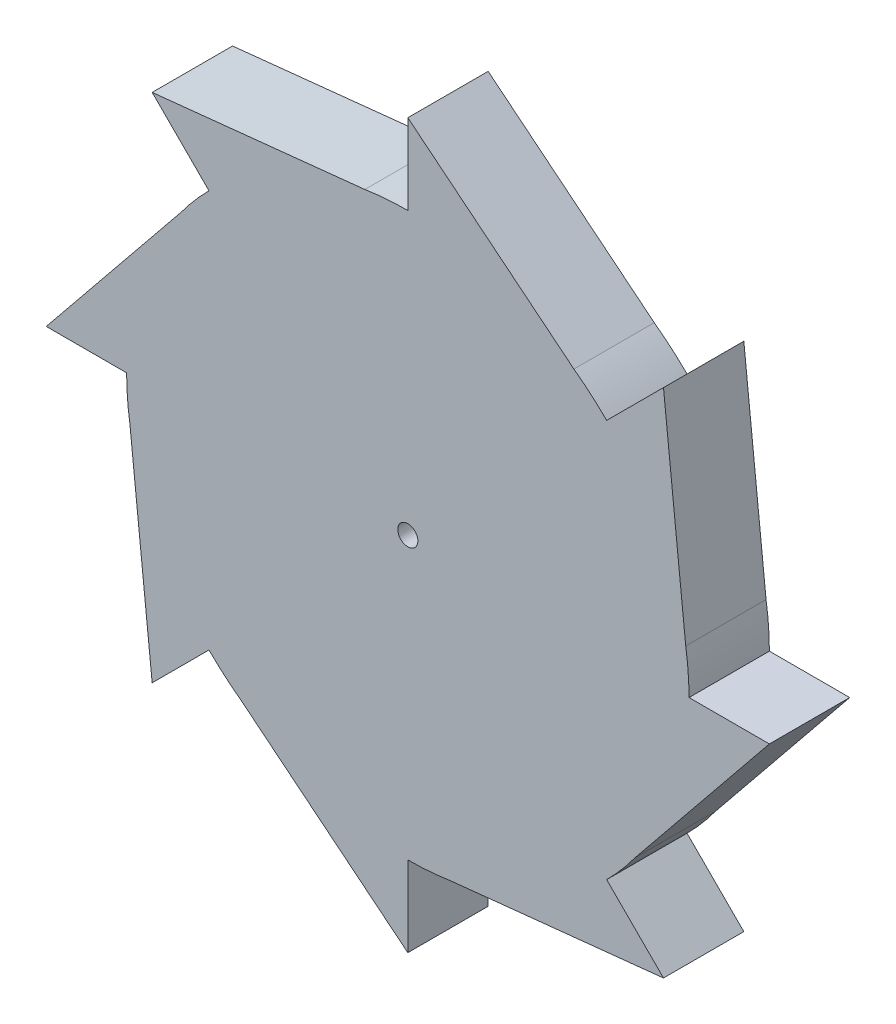
ISO-10303-21;
HEADER;
FILE_DESCRIPTION(('STEP AP214'),'2;1');
FILE_NAME('part.step','',(''),(''),'','','');
FILE_SCHEMA(('AUTOMOTIVE_DESIGN { 1 0 10303 214 1 1 1 1 }'));
ENDSEC;
DATA;
#1=APPLICATION_CONTEXT('core data for automotive mechanical design processes');
#2=APPLICATION_PROTOCOL_DEFINITION('international standard','automotive_design',2000,#1);
#3=PRODUCT_CONTEXT('',#1,'mechanical');
#4=PRODUCT('Part','Part','',(#3));
#5=PRODUCT_RELATED_PRODUCT_CATEGORY('part','',(#4));
#6=PRODUCT_DEFINITION_FORMATION('','',#4);
#7=PRODUCT_DEFINITION_CONTEXT('part definition',#1,'design');
#8=PRODUCT_DEFINITION('design','',#6,#7);
#9=PRODUCT_DEFINITION_SHAPE('','',#8);
#10=(LENGTH_UNIT() NAMED_UNIT(*) SI_UNIT(.MILLI.,.METRE.));
#11=(NAMED_UNIT(*) PLANE_ANGLE_UNIT() SI_UNIT($,.RADIAN.));
#12=(NAMED_UNIT(*) SI_UNIT($,.STERADIAN.) SOLID_ANGLE_UNIT());
#13=UNCERTAINTY_MEASURE_WITH_UNIT(LENGTH_MEASURE(1.E-05),#10,'distance_accuracy_value','');
#14=(GEOMETRIC_REPRESENTATION_CONTEXT(3) GLOBAL_UNCERTAINTY_ASSIGNED_CONTEXT((#13)) GLOBAL_UNIT_ASSIGNED_CONTEXT((#10,
#11,#12)) REPRESENTATION_CONTEXT('',''));
#15=CARTESIAN_POINT('',(0.,0.,0.));
#16=DIRECTION('',(0.,0.,1.));
#17=DIRECTION('',(1.,0.,0.));
#18=AXIS2_PLACEMENT_3D('',#15,#16,#17);
#19=CARTESIAN_POINT('',(0.,0.,6.35));
#20=DIRECTION('',(0.,0.,-1.));
#21=DIRECTION('',(-1.,0.,0.));
#22=AXIS2_PLACEMENT_3D('',#19,#20,#21);
#23=CYLINDRICAL_SURFACE('',#22,22.225);
#24=CARTESIAN_POINT('',(0.,0.,0.));
#25=DIRECTION('',(0.,0.,1.));
#26=DIRECTION('',(1.,0.,0.));
#27=AXIS2_PLACEMENT_3D('',#24,#25,#26);
#28=CIRCLE('',#27,22.225);
#29=CARTESIAN_POINT('',(0.,22.225,0.));
#30=VERTEX_POINT('',#29);
#31=CARTESIAN_POINT('',(-3.39977651162355,21.9634274345106,0.));
#32=VERTEX_POINT('',#31);
#33=EDGE_CURVE('E225',#30,#32,#28,.T.);
#34=ORIENTED_EDGE('',*,*,#33,.T.);
#35=DIRECTION('',(0.,0.,-1.));
#36=VECTOR('',#35,1.);
#37=CARTESIAN_POINT('',(-3.39977651162355,21.9634274345106,6.35));
#38=LINE('',#37,#36);
#39=CARTESIAN_POINT('',(-3.39977651162355,21.9634274345106,6.35));
#40=VERTEX_POINT('',#39);
#41=EDGE_CURVE('E11',#40,#32,#38,.T.);
#42=ORIENTED_EDGE('',*,*,#41,.F.);
#43=CARTESIAN_POINT('',(0.,0.,6.35));
#44=DIRECTION('',(0.,0.,1.));
#45=DIRECTION('',(1.,0.,0.));
#46=AXIS2_PLACEMENT_3D('',#43,#44,#45);
#47=CIRCLE('',#46,22.225);
#48=CARTESIAN_POINT('',(0.,22.225,6.35));
#49=VERTEX_POINT('',#48);
#50=EDGE_CURVE('E272',#49,#40,#47,.T.);
#51=ORIENTED_EDGE('',*,*,#50,.F.);
#52=DIRECTION('',(0.,0.,-1.));
#53=VECTOR('',#52,1.);
#54=CARTESIAN_POINT('',(0.,22.225,6.35));
#55=LINE('',#54,#53);
#56=EDGE_CURVE('E221',#49,#30,#55,.T.);
#57=ORIENTED_EDGE('',*,*,#56,.T.);
#58=EDGE_LOOP('',(#34,#42,#51,#57));
#59=FACE_BOUND('',#58,.T.);
#60=ADVANCED_FACE('F33',(#59),#23,.T.);
#61=CARTESIAN_POINT('',(-20.2055762724053,20.2055762724058,6.35));
#62=DIRECTION('',(0.104030352760059,-0.994574122780508,0.));
#63=DIRECTION('',(0.994574122780508,0.104030352760059,0.));
#64=AXIS2_PLACEMENT_3D('',#61,#62,#63);
#65=PLANE('',#64);
#66=DIRECTION('',(-0.994574122780508,-0.104030352760059,0.));
#67=VECTOR('',#66,1.);
#68=CARTESIAN_POINT('',(-20.2055762724053,20.2055762724058,0.));
#69=LINE('',#68,#67);
#70=CARTESIAN_POINT('',(-20.2055762724053,20.2055762724058,0.));
#71=VERTEX_POINT('',#70);
#72=EDGE_CURVE('E228',#32,#71,#69,.T.);
#73=ORIENTED_EDGE('',*,*,#72,.T.);
#74=DIRECTION('',(0.,0.,-1.));
#75=VECTOR('',#74,1.);
#76=CARTESIAN_POINT('',(-20.2055762724053,20.2055762724058,6.35));
#77=LINE('',#76,#75);
#78=CARTESIAN_POINT('',(-20.2055762724053,20.2055762724058,6.35));
#79=VERTEX_POINT('',#78);
#80=EDGE_CURVE('E41',#79,#71,#77,.T.);
#81=ORIENTED_EDGE('',*,*,#80,.F.);
#82=DIRECTION('',(-0.994574122780508,-0.104030352760059,0.));
#83=VECTOR('',#82,1.);
#84=CARTESIAN_POINT('',(-20.2055762724053,20.2055762724058,6.35));
#85=LINE('',#84,#83);
#86=EDGE_CURVE('E140',#40,#79,#85,.T.);
#87=ORIENTED_EDGE('',*,*,#86,.F.);
#88=ORIENTED_EDGE('',*,*,#41,.T.);
#89=EDGE_LOOP('',(#73,#81,#87,#88));
#90=FACE_BOUND('',#89,.T.);
#91=ADVANCED_FACE('F411',(#90),#65,.F.);
#92=CARTESIAN_POINT('',(-15.7154482118708,15.7154482118712,6.35));
#93=DIRECTION('',(0.707106781186556,0.707106781186539,0.));
#94=DIRECTION('',(-0.707106781186539,0.707106781186556,0.));
#95=AXIS2_PLACEMENT_3D('',#92,#93,#94);
#96=PLANE('',#95);
#97=DIRECTION('',(0.707106781186539,-0.707106781186556,0.));
#98=VECTOR('',#97,1.);
#99=CARTESIAN_POINT('',(-15.7154482118708,15.7154482118712,0.));
#100=LINE('',#99,#98);
#101=CARTESIAN_POINT('',(-15.7154482118708,15.7154482118712,0.));
#102=VERTEX_POINT('',#101);
#103=EDGE_CURVE('E231',#71,#102,#100,.T.);
#104=ORIENTED_EDGE('',*,*,#103,.T.);
#105=DIRECTION('',(0.,0.,-1.));
#106=VECTOR('',#105,1.);
#107=CARTESIAN_POINT('',(-15.7154482118708,15.7154482118712,6.35));
#108=LINE('',#107,#106);
#109=CARTESIAN_POINT('',(-15.7154482118708,15.7154482118712,6.35));
#110=VERTEX_POINT('',#109);
#111=EDGE_CURVE('E327',#110,#102,#108,.T.);
#112=ORIENTED_EDGE('',*,*,#111,.F.);
#113=DIRECTION('',(0.707106781186539,-0.707106781186556,0.));
#114=VECTOR('',#113,1.);
#115=CARTESIAN_POINT('',(-15.7154482118708,15.7154482118712,6.35));
#116=LINE('',#115,#114);
#117=EDGE_CURVE('E335',#79,#110,#116,.T.);
#118=ORIENTED_EDGE('',*,*,#117,.F.);
#119=ORIENTED_EDGE('',*,*,#80,.T.);
#120=EDGE_LOOP('',(#104,#112,#118,#119));
#121=FACE_BOUND('',#120,.T.);
#122=ADVANCED_FACE('F333',(#121),#96,.F.);
#123=CARTESIAN_POINT('',(0.,0.,6.35));
#124=DIRECTION('',(0.,0.,-1.));
#125=DIRECTION('',(-1.,0.,0.));
#126=AXIS2_PLACEMENT_3D('',#123,#124,#125);
#127=CYLINDRICAL_SURFACE('',#126,22.225);
#128=CARTESIAN_POINT('',(0.,0.,0.));
#129=DIRECTION('',(0.,0.,1.));
#130=DIRECTION('',(1.,0.,0.));
#131=AXIS2_PLACEMENT_3D('',#128,#129,#130);
#132=CIRCLE('',#131,22.225);
#133=CARTESIAN_POINT('',(-17.9344935029289,13.1264834511533,0.));
#134=VERTEX_POINT('',#133);
#135=EDGE_CURVE('E233',#102,#134,#132,.T.);
#136=ORIENTED_EDGE('',*,*,#135,.T.);
#137=DIRECTION('',(0.,0.,-1.));
#138=VECTOR('',#137,1.);
#139=CARTESIAN_POINT('',(-17.9344935029289,13.1264834511533,6.35));
#140=LINE('',#139,#138);
#141=CARTESIAN_POINT('',(-17.9344935029289,13.1264834511533,6.35));
#142=VERTEX_POINT('',#141);
#143=EDGE_CURVE('E324',#142,#134,#140,.T.);
#144=ORIENTED_EDGE('',*,*,#143,.F.);
#145=CARTESIAN_POINT('',(0.,0.,6.35));
#146=DIRECTION('',(0.,0.,1.));
#147=DIRECTION('',(1.,0.,0.));
#148=AXIS2_PLACEMENT_3D('',#145,#146,#147);
#149=CIRCLE('',#148,22.225);
#150=EDGE_CURVE('E353',#110,#142,#149,.T.);
#151=ORIENTED_EDGE('',*,*,#150,.F.);
#152=ORIENTED_EDGE('',*,*,#111,.T.);
#153=EDGE_LOOP('',(#136,#144,#151,#152));
#154=FACE_BOUND('',#153,.T.);
#155=ADVANCED_FACE('F344',(#154),#127,.T.);
#156=CARTESIAN_POINT('',(-28.575,2.99307237772328E-13,6.35));
#157=DIRECTION('',(0.776830674496627,-0.629709538724892,0.));
#158=DIRECTION('',(0.629709538724892,0.776830674496627,0.));
#159=AXIS2_PLACEMENT_3D('',#156,#157,#158);
#160=PLANE('',#159);
#161=DIRECTION('',(-0.629709538724892,-0.776830674496627,0.));
#162=VECTOR('',#161,1.);
#163=CARTESIAN_POINT('',(-28.575,2.99307237772328E-13,0.));
#164=LINE('',#163,#162);
#165=CARTESIAN_POINT('',(-28.575,2.99307237772328E-13,0.));
#166=VERTEX_POINT('',#165);
#167=EDGE_CURVE('E235',#134,#166,#164,.T.);
#168=ORIENTED_EDGE('',*,*,#167,.T.);
#169=DIRECTION('',(0.,0.,-1.));
#170=VECTOR('',#169,1.);
#171=CARTESIAN_POINT('',(-28.575,2.99307237772328E-13,6.35));
#172=LINE('',#171,#170);
#173=CARTESIAN_POINT('',(-28.575,2.99307237772328E-13,6.35));
#174=VERTEX_POINT('',#173);
#175=EDGE_CURVE('E321',#174,#166,#172,.T.);
#176=ORIENTED_EDGE('',*,*,#175,.F.);
#177=DIRECTION('',(-0.629709538724892,-0.776830674496627,0.));
#178=VECTOR('',#177,1.);
#179=CARTESIAN_POINT('',(-28.575,2.99307237772328E-13,6.35));
#180=LINE('',#179,#178);
#181=EDGE_CURVE('E350',#142,#174,#180,.T.);
#182=ORIENTED_EDGE('',*,*,#181,.F.);
#183=ORIENTED_EDGE('',*,*,#143,.T.);
#184=EDGE_LOOP('',(#168,#176,#182,#183));
#185=FACE_BOUND('',#184,.T.);
#186=ADVANCED_FACE('F348',(#185),#160,.F.);
#187=CARTESIAN_POINT('',(-22.225,2.32794518267366E-13,6.35));
#188=DIRECTION('',(0.,1.,0.));
#189=DIRECTION('',(-1.,0.,0.));
#190=AXIS2_PLACEMENT_3D('',#187,#188,#189);
#191=PLANE('',#190);
#192=DIRECTION('',(1.,0.,0.));
#193=VECTOR('',#192,1.);
#194=CARTESIAN_POINT('',(-22.225,2.32794518267366E-13,0.));
#195=LINE('',#194,#193);
#196=CARTESIAN_POINT('',(-22.225,2.29729079356211E-13,0.));
#197=VERTEX_POINT('',#196);
#198=EDGE_CURVE('E237',#166,#197,#195,.T.);
#199=ORIENTED_EDGE('',*,*,#198,.T.);
#200=DIRECTION('',(0.,0.,-1.));
#201=VECTOR('',#200,1.);
#202=CARTESIAN_POINT('',(-22.225,2.29729079356211E-13,6.35));
#203=LINE('',#202,#201);
#204=CARTESIAN_POINT('',(-22.225,2.29729079356211E-13,6.35));
#205=VERTEX_POINT('',#204);
#206=EDGE_CURVE('E318',#205,#197,#203,.T.);
#207=ORIENTED_EDGE('',*,*,#206,.F.);
#208=DIRECTION('',(1.,0.,0.));
#209=VECTOR('',#208,1.);
#210=CARTESIAN_POINT('',(-22.225,2.32794518267366E-13,6.35));
#211=LINE('',#210,#209);
#212=EDGE_CURVE('E352',#174,#205,#211,.T.);
#213=ORIENTED_EDGE('',*,*,#212,.F.);
#214=ORIENTED_EDGE('',*,*,#175,.T.);
#215=EDGE_LOOP('',(#199,#207,#213,#214));
#216=FACE_BOUND('',#215,.T.);
#217=ADVANCED_FACE('F424',(#216),#191,.F.);
#218=CARTESIAN_POINT('',(0.,0.,6.35));
#219=DIRECTION('',(0.,0.,-1.));
#220=DIRECTION('',(-1.,0.,0.));
#221=AXIS2_PLACEMENT_3D('',#218,#219,#220);
#222=CYLINDRICAL_SURFACE('',#221,22.225);
#223=CARTESIAN_POINT('',(0.,0.,0.));
#224=DIRECTION('',(0.,0.,1.));
#225=DIRECTION('',(1.,0.,0.));
#226=AXIS2_PLACEMENT_3D('',#223,#224,#225);
#227=CIRCLE('',#226,22.225);
#228=CARTESIAN_POINT('',(-21.9634274345106,-3.39977651162355,0.));
#229=VERTEX_POINT('',#228);
#230=EDGE_CURVE('E239',#197,#229,#227,.T.);
#231=ORIENTED_EDGE('',*,*,#230,.T.);
#232=DIRECTION('',(0.,0.,-1.));
#233=VECTOR('',#232,1.);
#234=CARTESIAN_POINT('',(-21.9634274345106,-3.39977651162355,6.35));
#235=LINE('',#234,#233);
#236=CARTESIAN_POINT('',(-21.9634274345106,-3.39977651162355,6.35));
#237=VERTEX_POINT('',#236);
#238=EDGE_CURVE('E315',#237,#229,#235,.T.);
#239=ORIENTED_EDGE('',*,*,#238,.F.);
#240=CARTESIAN_POINT('',(0.,0.,6.35));
#241=DIRECTION('',(0.,0.,1.));
#242=DIRECTION('',(1.,0.,0.));
#243=AXIS2_PLACEMENT_3D('',#240,#241,#242);
#244=CIRCLE('',#243,22.225);
#245=EDGE_CURVE('E355',#205,#237,#244,.T.);
#246=ORIENTED_EDGE('',*,*,#245,.F.);
#247=ORIENTED_EDGE('',*,*,#206,.T.);
#248=EDGE_LOOP('',(#231,#239,#246,#247));
#249=FACE_BOUND('',#248,.T.);
#250=ADVANCED_FACE('F427',(#249),#222,.T.);
#251=CARTESIAN_POINT('',(-20.2055762724058,-20.2055762724054,6.35));
#252=DIRECTION('',(0.994574122780508,0.104030352760062,0.));
#253=DIRECTION('',(-0.104030352760063,0.994574122780508,0.));
#254=AXIS2_PLACEMENT_3D('',#251,#252,#253);
#255=PLANE('',#254);
#256=DIRECTION('',(0.104030352760062,-0.994574122780508,0.));
#257=VECTOR('',#256,1.);
#258=CARTESIAN_POINT('',(-20.2055762724058,-20.2055762724054,0.));
#259=LINE('',#258,#257);
#260=CARTESIAN_POINT('',(-20.2055762724058,-20.2055762724054,0.));
#261=VERTEX_POINT('',#260);
#262=EDGE_CURVE('E241',#229,#261,#259,.T.);
#263=ORIENTED_EDGE('',*,*,#262,.T.);
#264=DIRECTION('',(0.,0.,-1.));
#265=VECTOR('',#264,1.);
#266=CARTESIAN_POINT('',(-20.2055762724058,-20.2055762724054,6.35));
#267=LINE('',#266,#265);
#268=CARTESIAN_POINT('',(-20.2055762724058,-20.2055762724054,6.35));
#269=VERTEX_POINT('',#268);
#270=EDGE_CURVE('E312',#269,#261,#267,.T.);
#271=ORIENTED_EDGE('',*,*,#270,.F.);
#272=DIRECTION('',(0.104030352760062,-0.994574122780508,0.));
#273=VECTOR('',#272,1.);
#274=CARTESIAN_POINT('',(-20.2055762724058,-20.2055762724054,6.35));
#275=LINE('',#274,#273);
#276=EDGE_CURVE('E361',#237,#269,#275,.T.);
#277=ORIENTED_EDGE('',*,*,#276,.F.);
#278=ORIENTED_EDGE('',*,*,#238,.T.);
#279=EDGE_LOOP('',(#263,#271,#277,#278));
#280=FACE_BOUND('',#279,.T.);
#281=ADVANCED_FACE('F431',(#280),#255,.F.);
#282=CARTESIAN_POINT('',(-15.7154482118712,-15.7154482118709,6.35));
#283=DIRECTION('',(-0.707106781186541,0.707106781186554,0.));
#284=DIRECTION('',(-0.707106781186554,-0.707106781186541,0.));
#285=AXIS2_PLACEMENT_3D('',#282,#283,#284);
#286=PLANE('',#285);
#287=DIRECTION('',(0.707106781186554,0.707106781186541,0.));
#288=VECTOR('',#287,1.);
#289=CARTESIAN_POINT('',(-15.7154482118712,-15.7154482118709,0.));
#290=LINE('',#289,#288);
#291=CARTESIAN_POINT('',(-15.7154482118712,-15.7154482118709,0.));
#292=VERTEX_POINT('',#291);
#293=EDGE_CURVE('E243',#261,#292,#290,.T.);
#294=ORIENTED_EDGE('',*,*,#293,.T.);
#295=DIRECTION('',(0.,0.,-1.));
#296=VECTOR('',#295,1.);
#297=CARTESIAN_POINT('',(-15.7154482118712,-15.7154482118709,6.35));
#298=LINE('',#297,#296);
#299=CARTESIAN_POINT('',(-15.7154482118712,-15.7154482118709,6.35));
#300=VERTEX_POINT('',#299);
#301=EDGE_CURVE('E309',#300,#292,#298,.T.);
#302=ORIENTED_EDGE('',*,*,#301,.F.);
#303=DIRECTION('',(0.707106781186554,0.707106781186541,0.));
#304=VECTOR('',#303,1.);
#305=CARTESIAN_POINT('',(-15.7154482118712,-15.7154482118709,6.35));
#306=LINE('',#305,#304);
#307=EDGE_CURVE('E363',#269,#300,#306,.T.);
#308=ORIENTED_EDGE('',*,*,#307,.F.);
#309=ORIENTED_EDGE('',*,*,#270,.T.);
#310=EDGE_LOOP('',(#294,#302,#308,#309));
#311=FACE_BOUND('',#310,.T.);
#312=ADVANCED_FACE('F435',(#311),#286,.F.);
#313=CARTESIAN_POINT('',(0.,0.,6.35));
#314=DIRECTION('',(0.,0.,-1.));
#315=DIRECTION('',(-1.,0.,0.));
#316=AXIS2_PLACEMENT_3D('',#313,#314,#315);
#317=CYLINDRICAL_SURFACE('',#316,22.225);
#318=CARTESIAN_POINT('',(0.,0.,0.));
#319=DIRECTION('',(0.,0.,1.));
#320=DIRECTION('',(1.,0.,0.));
#321=AXIS2_PLACEMENT_3D('',#318,#319,#320);
#322=CIRCLE('',#321,22.225);
#323=CARTESIAN_POINT('',(-13.1264834511533,-17.9344935029289,0.));
#324=VERTEX_POINT('',#323);
#325=EDGE_CURVE('E245',#292,#324,#322,.T.);
#326=ORIENTED_EDGE('',*,*,#325,.T.);
#327=DIRECTION('',(0.,0.,-1.));
#328=VECTOR('',#327,1.);
#329=CARTESIAN_POINT('',(-13.1264834511533,-17.9344935029289,6.35));
#330=LINE('',#329,#328);
#331=CARTESIAN_POINT('',(-13.1264834511533,-17.9344935029289,6.35));
#332=VERTEX_POINT('',#331);
#333=EDGE_CURVE('E306',#332,#324,#330,.T.);
#334=ORIENTED_EDGE('',*,*,#333,.F.);
#335=CARTESIAN_POINT('',(0.,0.,6.35));
#336=DIRECTION('',(0.,0.,1.));
#337=DIRECTION('',(1.,0.,0.));
#338=AXIS2_PLACEMENT_3D('',#335,#336,#337);
#339=CIRCLE('',#338,22.225);
#340=EDGE_CURVE('E365',#300,#332,#339,.T.);
#341=ORIENTED_EDGE('',*,*,#340,.F.);
#342=ORIENTED_EDGE('',*,*,#301,.T.);
#343=EDGE_LOOP('',(#326,#334,#341,#342));
#344=FACE_BOUND('',#343,.T.);
#345=ADVANCED_FACE('F439',(#344),#317,.T.);
#346=CARTESIAN_POINT('',(-1.99538158514885E-13,-28.575,6.35));
#347=DIRECTION('',(0.629709538724889,0.776830674496629,0.));
#348=DIRECTION('',(-0.776830674496629,0.629709538724889,0.));
#349=AXIS2_PLACEMENT_3D('',#346,#347,#348);
#350=PLANE('',#349);
#351=DIRECTION('',(0.776830674496629,-0.629709538724889,0.));
#352=VECTOR('',#351,1.);
#353=CARTESIAN_POINT('',(-1.99538158514885E-13,-28.575,0.));
#354=LINE('',#353,#352);
#355=CARTESIAN_POINT('',(-1.99538158514885E-13,-28.575,0.));
#356=VERTEX_POINT('',#355);
#357=EDGE_CURVE('E247',#324,#356,#354,.T.);
#358=ORIENTED_EDGE('',*,*,#357,.T.);
#359=DIRECTION('',(0.,0.,-1.));
#360=VECTOR('',#359,1.);
#361=CARTESIAN_POINT('',(-1.99538158514885E-13,-28.575,6.35));
#362=LINE('',#361,#360);
#363=CARTESIAN_POINT('',(-1.99538158514885E-13,-28.575,6.35));
#364=VERTEX_POINT('',#363);
#365=EDGE_CURVE('E303',#364,#356,#362,.T.);
#366=ORIENTED_EDGE('',*,*,#365,.F.);
#367=DIRECTION('',(0.776830674496629,-0.629709538724889,0.));
#368=VECTOR('',#367,1.);
#369=CARTESIAN_POINT('',(-1.99538158514885E-13,-28.575,6.35));
#370=LINE('',#369,#368);
#371=EDGE_CURVE('E367',#332,#364,#370,.T.);
#372=ORIENTED_EDGE('',*,*,#371,.F.);
#373=ORIENTED_EDGE('',*,*,#333,.T.);
#374=EDGE_LOOP('',(#358,#366,#372,#373));
#375=FACE_BOUND('',#374,.T.);
#376=ADVANCED_FACE('F443',(#375),#350,.F.);
#377=CARTESIAN_POINT('',(-1.55196345511577E-13,-22.225,6.35));
#378=DIRECTION('',(-1.,0.,0.));
#379=DIRECTION('',(0.,-1.,0.));
#380=AXIS2_PLACEMENT_3D('',#377,#378,#379);
#381=PLANE('',#380);
#382=DIRECTION('',(0.,1.,0.));
#383=VECTOR('',#382,1.);
#384=CARTESIAN_POINT('',(-1.55196345511577E-13,-22.225,0.));
#385=LINE('',#384,#383);
#386=CARTESIAN_POINT('',(-1.6200078928934E-13,-22.225,0.));
#387=VERTEX_POINT('',#386);
#388=EDGE_CURVE('E249',#356,#387,#385,.T.);
#389=ORIENTED_EDGE('',*,*,#388,.T.);
#390=DIRECTION('',(0.,0.,-1.));
#391=VECTOR('',#390,1.);
#392=CARTESIAN_POINT('',(-1.6200078928934E-13,-22.225,6.35));
#393=LINE('',#392,#391);
#394=CARTESIAN_POINT('',(-1.6200078928934E-13,-22.225,6.35));
#395=VERTEX_POINT('',#394);
#396=EDGE_CURVE('E300',#395,#387,#393,.T.);
#397=ORIENTED_EDGE('',*,*,#396,.F.);
#398=DIRECTION('',(0.,1.,0.));
#399=VECTOR('',#398,1.);
#400=CARTESIAN_POINT('',(-1.55196345511577E-13,-22.225,6.35));
#401=LINE('',#400,#399);
#402=EDGE_CURVE('E369',#364,#395,#401,.T.);
#403=ORIENTED_EDGE('',*,*,#402,.F.);
#404=ORIENTED_EDGE('',*,*,#365,.T.);
#405=EDGE_LOOP('',(#389,#397,#403,#404));
#406=FACE_BOUND('',#405,.T.);
#407=ADVANCED_FACE('F447',(#406),#381,.F.);
#408=CARTESIAN_POINT('',(0.,0.,6.35));
#409=DIRECTION('',(0.,0.,-1.));
#410=DIRECTION('',(-1.,0.,0.));
#411=AXIS2_PLACEMENT_3D('',#408,#409,#410);
#412=CYLINDRICAL_SURFACE('',#411,22.225);
#413=CARTESIAN_POINT('',(0.,0.,0.));
#414=DIRECTION('',(0.,0.,1.));
#415=DIRECTION('',(1.,0.,0.));
#416=AXIS2_PLACEMENT_3D('',#413,#414,#415);
#417=CIRCLE('',#416,22.225);
#418=CARTESIAN_POINT('',(3.39977651162355,-21.9634274345106,0.));
#419=VERTEX_POINT('',#418);
#420=EDGE_CURVE('E251',#387,#419,#417,.T.);
#421=ORIENTED_EDGE('',*,*,#420,.T.);
#422=DIRECTION('',(0.,0.,-1.));
#423=VECTOR('',#422,1.);
#424=CARTESIAN_POINT('',(3.39977651162355,-21.9634274345106,6.35));
#425=LINE('',#424,#423);
#426=CARTESIAN_POINT('',(3.39977651162355,-21.9634274345106,6.35));
#427=VERTEX_POINT('',#426);
#428=EDGE_CURVE('E297',#427,#419,#425,.T.);
#429=ORIENTED_EDGE('',*,*,#428,.F.);
#430=CARTESIAN_POINT('',(0.,0.,6.35));
#431=DIRECTION('',(0.,0.,1.));
#432=DIRECTION('',(1.,0.,0.));
#433=AXIS2_PLACEMENT_3D('',#430,#431,#432);
#434=CIRCLE('',#433,22.225);
#435=EDGE_CURVE('E371',#395,#427,#434,.T.);
#436=ORIENTED_EDGE('',*,*,#435,.F.);
#437=ORIENTED_EDGE('',*,*,#396,.T.);
#438=EDGE_LOOP('',(#421,#429,#436,#437));
#439=FACE_BOUND('',#438,.T.);
#440=ADVANCED_FACE('F451',(#439),#412,.T.);
#441=CARTESIAN_POINT('',(20.2055762724055,-20.2055762724057,6.35));
#442=DIRECTION('',(-0.104030352760066,0.994574122780507,0.));
#443=DIRECTION('',(-0.994574122780508,-0.104030352760066,0.));
#444=AXIS2_PLACEMENT_3D('',#441,#442,#443);
#445=PLANE('',#444);
#446=DIRECTION('',(0.994574122780507,0.104030352760066,0.));
#447=VECTOR('',#446,1.);
#448=CARTESIAN_POINT('',(20.2055762724055,-20.2055762724057,0.));
#449=LINE('',#448,#447);
#450=CARTESIAN_POINT('',(20.2055762724055,-20.2055762724057,0.));
#451=VERTEX_POINT('',#450);
#452=EDGE_CURVE('E253',#419,#451,#449,.T.);
#453=ORIENTED_EDGE('',*,*,#452,.T.);
#454=DIRECTION('',(0.,0.,-1.));
#455=VECTOR('',#454,1.);
#456=CARTESIAN_POINT('',(20.2055762724055,-20.2055762724057,6.35));
#457=LINE('',#456,#455);
#458=CARTESIAN_POINT('',(20.2055762724055,-20.2055762724057,6.35));
#459=VERTEX_POINT('',#458);
#460=EDGE_CURVE('E294',#459,#451,#457,.T.);
#461=ORIENTED_EDGE('',*,*,#460,.F.);
#462=DIRECTION('',(0.994574122780507,0.104030352760066,0.));
#463=VECTOR('',#462,1.);
#464=CARTESIAN_POINT('',(20.2055762724055,-20.2055762724057,6.35));
#465=LINE('',#464,#463);
#466=EDGE_CURVE('E373',#427,#459,#465,.T.);
#467=ORIENTED_EDGE('',*,*,#466,.F.);
#468=ORIENTED_EDGE('',*,*,#428,.T.);
#469=EDGE_LOOP('',(#453,#461,#467,#468));
#470=FACE_BOUND('',#469,.T.);
#471=ADVANCED_FACE('F455',(#470),#445,.F.);
#472=CARTESIAN_POINT('',(15.7154482118709,-15.7154482118711,6.35));
#473=DIRECTION('',(-0.707106781186551,-0.707106781186544,0.));
#474=DIRECTION('',(0.707106781186544,-0.707106781186551,0.));
#475=AXIS2_PLACEMENT_3D('',#472,#473,#474);
#476=PLANE('',#475);
#477=DIRECTION('',(-0.707106781186544,0.707106781186551,0.));
#478=VECTOR('',#477,1.);
#479=CARTESIAN_POINT('',(15.7154482118709,-15.7154482118711,0.));
#480=LINE('',#479,#478);
#481=CARTESIAN_POINT('',(15.7154482118709,-15.7154482118711,0.));
#482=VERTEX_POINT('',#481);
#483=EDGE_CURVE('E255',#451,#482,#480,.T.);
#484=ORIENTED_EDGE('',*,*,#483,.T.);
#485=DIRECTION('',(0.,0.,-1.));
#486=VECTOR('',#485,1.);
#487=CARTESIAN_POINT('',(15.7154482118709,-15.7154482118711,6.35));
#488=LINE('',#487,#486);
#489=CARTESIAN_POINT('',(15.7154482118709,-15.7154482118711,6.35));
#490=VERTEX_POINT('',#489);
#491=EDGE_CURVE('E291',#490,#482,#488,.T.);
#492=ORIENTED_EDGE('',*,*,#491,.F.);
#493=DIRECTION('',(-0.707106781186544,0.707106781186551,0.));
#494=VECTOR('',#493,1.);
#495=CARTESIAN_POINT('',(15.7154482118709,-15.7154482118711,6.35));
#496=LINE('',#495,#494);
#497=EDGE_CURVE('E375',#459,#490,#496,.T.);
#498=ORIENTED_EDGE('',*,*,#497,.F.);
#499=ORIENTED_EDGE('',*,*,#460,.T.);
#500=EDGE_LOOP('',(#484,#492,#498,#499));
#501=FACE_BOUND('',#500,.T.);
#502=ADVANCED_FACE('F459',(#501),#476,.F.);
#503=CARTESIAN_POINT('',(0.,0.,6.35));
#504=DIRECTION('',(0.,0.,-1.));
#505=DIRECTION('',(-1.,0.,0.));
#506=AXIS2_PLACEMENT_3D('',#503,#504,#505);
#507=CYLINDRICAL_SURFACE('',#506,22.225);
#508=CARTESIAN_POINT('',(0.,0.,0.));
#509=DIRECTION('',(0.,0.,1.));
#510=DIRECTION('',(1.,0.,0.));
#511=AXIS2_PLACEMENT_3D('',#508,#509,#510);
#512=CIRCLE('',#511,22.225);
#513=CARTESIAN_POINT('',(17.9344935029289,-13.1264834511533,0.));
#514=VERTEX_POINT('',#513);
#515=EDGE_CURVE('E257',#482,#514,#512,.T.);
#516=ORIENTED_EDGE('',*,*,#515,.T.);
#517=DIRECTION('',(0.,0.,-1.));
#518=VECTOR('',#517,1.);
#519=CARTESIAN_POINT('',(17.9344935029289,-13.1264834511533,6.35));
#520=LINE('',#519,#518);
#521=CARTESIAN_POINT('',(17.9344935029289,-13.1264834511533,6.35));
#522=VERTEX_POINT('',#521);
#523=EDGE_CURVE('E288',#522,#514,#520,.T.);
#524=ORIENTED_EDGE('',*,*,#523,.F.);
#525=CARTESIAN_POINT('',(0.,0.,6.35));
#526=DIRECTION('',(0.,0.,1.));
#527=DIRECTION('',(1.,0.,0.));
#528=AXIS2_PLACEMENT_3D('',#525,#526,#527);
#529=CIRCLE('',#528,22.225);
#530=EDGE_CURVE('E377',#490,#522,#529,.T.);
#531=ORIENTED_EDGE('',*,*,#530,.F.);
#532=ORIENTED_EDGE('',*,*,#491,.T.);
#533=EDGE_LOOP('',(#516,#524,#531,#532));
#534=FACE_BOUND('',#533,.T.);
#535=ADVANCED_FACE('F463',(#534),#507,.T.);
#536=CARTESIAN_POINT('',(28.575,0.,6.35));
#537=DIRECTION('',(-0.776830674496631,0.629709538724886,0.));
#538=DIRECTION('',(-0.629709538724886,-0.776830674496631,0.));
#539=AXIS2_PLACEMENT_3D('',#536,#537,#538);
#540=PLANE('',#539);
#541=DIRECTION('',(0.629709538724886,0.776830674496631,0.));
#542=VECTOR('',#541,1.);
#543=CARTESIAN_POINT('',(28.575,0.,0.));
#544=LINE('',#543,#542);
#545=CARTESIAN_POINT('',(28.575,0.,0.));
#546=VERTEX_POINT('',#545);
#547=EDGE_CURVE('E259',#514,#546,#544,.T.);
#548=ORIENTED_EDGE('',*,*,#547,.T.);
#549=DIRECTION('',(0.,0.,-1.));
#550=VECTOR('',#549,1.);
#551=CARTESIAN_POINT('',(28.575,0.,6.35));
#552=LINE('',#551,#550);
#553=CARTESIAN_POINT('',(28.575,0.,6.35));
#554=VERTEX_POINT('',#553);
#555=EDGE_CURVE('E285',#554,#546,#552,.T.);
#556=ORIENTED_EDGE('',*,*,#555,.F.);
#557=DIRECTION('',(0.629709538724886,0.776830674496631,0.));
#558=VECTOR('',#557,1.);
#559=CARTESIAN_POINT('',(28.575,0.,6.35));
#560=LINE('',#559,#558);
#561=EDGE_CURVE('E379',#522,#554,#560,.T.);
#562=ORIENTED_EDGE('',*,*,#561,.F.);
#563=ORIENTED_EDGE('',*,*,#523,.T.);
#564=EDGE_LOOP('',(#548,#556,#562,#563));
#565=FACE_BOUND('',#564,.T.);
#566=ADVANCED_FACE('F467',(#565),#540,.F.);
#567=CARTESIAN_POINT('',(22.225,0.,6.35));
#568=DIRECTION('',(0.,-1.,0.));
#569=DIRECTION('',(1.,0.,0.));
#570=AXIS2_PLACEMENT_3D('',#567,#568,#569);
#571=PLANE('',#570);
#572=DIRECTION('',(-1.,0.,0.));
#573=VECTOR('',#572,1.);
#574=CARTESIAN_POINT('',(22.225,0.,0.));
#575=LINE('',#574,#573);
#576=CARTESIAN_POINT('',(22.225,0.,0.));
#577=VERTEX_POINT('',#576);
#578=EDGE_CURVE('E261',#546,#577,#575,.T.);
#579=ORIENTED_EDGE('',*,*,#578,.T.);
#580=DIRECTION('',(0.,0.,-1.));
#581=VECTOR('',#580,1.);
#582=CARTESIAN_POINT('',(22.225,0.,6.35));
#583=LINE('',#582,#581);
#584=CARTESIAN_POINT('',(22.225,0.,6.35));
#585=VERTEX_POINT('',#584);
#586=EDGE_CURVE('E282',#585,#577,#583,.T.);
#587=ORIENTED_EDGE('',*,*,#586,.F.);
#588=DIRECTION('',(-1.,0.,0.));
#589=VECTOR('',#588,1.);
#590=CARTESIAN_POINT('',(22.225,0.,6.35));
#591=LINE('',#590,#589);
#592=EDGE_CURVE('E381',#554,#585,#591,.T.);
#593=ORIENTED_EDGE('',*,*,#592,.F.);
#594=ORIENTED_EDGE('',*,*,#555,.T.);
#595=EDGE_LOOP('',(#579,#587,#593,#594));
#596=FACE_BOUND('',#595,.T.);
#597=ADVANCED_FACE('F471',(#596),#571,.F.);
#598=CARTESIAN_POINT('',(0.,0.,6.35));
#599=DIRECTION('',(0.,0.,-1.));
#600=DIRECTION('',(-1.,0.,0.));
#601=AXIS2_PLACEMENT_3D('',#598,#599,#600);
#602=CYLINDRICAL_SURFACE('',#601,22.225);
#603=CARTESIAN_POINT('',(0.,0.,0.));
#604=DIRECTION('',(0.,0.,1.));
#605=DIRECTION('',(1.,0.,0.));
#606=AXIS2_PLACEMENT_3D('',#603,#604,#605);
#607=CIRCLE('',#606,22.225);
#608=CARTESIAN_POINT('',(21.9634274345106,3.39977651162355,0.));
#609=VERTEX_POINT('',#608);
#610=EDGE_CURVE('E263',#577,#609,#607,.T.);
#611=ORIENTED_EDGE('',*,*,#610,.T.);
#612=DIRECTION('',(0.,0.,-1.));
#613=VECTOR('',#612,1.);
#614=CARTESIAN_POINT('',(21.9634274345106,3.39977651162355,6.35));
#615=LINE('',#614,#613);
#616=CARTESIAN_POINT('',(21.9634274345106,3.39977651162355,6.35));
#617=VERTEX_POINT('',#616);
#618=EDGE_CURVE('E279',#617,#609,#615,.T.);
#619=ORIENTED_EDGE('',*,*,#618,.F.);
#620=CARTESIAN_POINT('',(0.,0.,6.35));
#621=DIRECTION('',(0.,0.,1.));
#622=DIRECTION('',(1.,0.,0.));
#623=AXIS2_PLACEMENT_3D('',#620,#621,#622);
#624=CIRCLE('',#623,22.225);
#625=EDGE_CURVE('E383',#585,#617,#624,.T.);
#626=ORIENTED_EDGE('',*,*,#625,.F.);
#627=ORIENTED_EDGE('',*,*,#586,.T.);
#628=EDGE_LOOP('',(#611,#619,#626,#627));
#629=FACE_BOUND('',#628,.T.);
#630=ADVANCED_FACE('F475',(#629),#602,.T.);
#631=CARTESIAN_POINT('',(20.2055762724056,20.2055762724056,6.35));
#632=DIRECTION('',(-0.994574122780507,-0.10403035276007,0.));
#633=DIRECTION('',(0.10403035276007,-0.994574122780507,0.));
#634=AXIS2_PLACEMENT_3D('',#631,#632,#633);
#635=PLANE('',#634);
#636=DIRECTION('',(-0.10403035276007,0.994574122780507,0.));
#637=VECTOR('',#636,1.);
#638=CARTESIAN_POINT('',(20.2055762724056,20.2055762724056,0.));
#639=LINE('',#638,#637);
#640=CARTESIAN_POINT('',(20.2055762724056,20.2055762724056,0.));
#641=VERTEX_POINT('',#640);
#642=EDGE_CURVE('E265',#609,#641,#639,.T.);
#643=ORIENTED_EDGE('',*,*,#642,.T.);
#644=DIRECTION('',(0.,0.,-1.));
#645=VECTOR('',#644,1.);
#646=CARTESIAN_POINT('',(20.2055762724056,20.2055762724056,6.35));
#647=LINE('',#646,#645);
#648=CARTESIAN_POINT('',(20.2055762724056,20.2055762724056,6.35));
#649=VERTEX_POINT('',#648);
#650=EDGE_CURVE('E276',#649,#641,#647,.T.);
#651=ORIENTED_EDGE('',*,*,#650,.F.);
#652=DIRECTION('',(-0.10403035276007,0.994574122780507,0.));
#653=VECTOR('',#652,1.);
#654=CARTESIAN_POINT('',(20.2055762724056,20.2055762724056,6.35));
#655=LINE('',#654,#653);
#656=EDGE_CURVE('E385',#617,#649,#655,.T.);
#657=ORIENTED_EDGE('',*,*,#656,.F.);
#658=ORIENTED_EDGE('',*,*,#618,.T.);
#659=EDGE_LOOP('',(#643,#651,#657,#658));
#660=FACE_BOUND('',#659,.T.);
#661=ADVANCED_FACE('F391',(#660),#635,.F.);
#662=CARTESIAN_POINT('',(15.715448211871,15.715448211871,6.35));
#663=DIRECTION('',(0.707106781186542,-0.707106781186553,0.));
#664=DIRECTION('',(0.707106781186553,0.707106781186542,0.));
#665=AXIS2_PLACEMENT_3D('',#662,#663,#664);
#666=PLANE('',#665);
#667=DIRECTION('',(-0.707106781186553,-0.707106781186542,0.));
#668=VECTOR('',#667,1.);
#669=CARTESIAN_POINT('',(15.715448211871,15.715448211871,0.));
#670=LINE('',#669,#668);
#671=CARTESIAN_POINT('',(15.715448211871,15.715448211871,0.));
#672=VERTEX_POINT('',#671);
#673=EDGE_CURVE('E267',#641,#672,#670,.T.);
#674=ORIENTED_EDGE('',*,*,#673,.T.);
#675=DIRECTION('',(0.,0.,-1.));
#676=VECTOR('',#675,1.);
#677=CARTESIAN_POINT('',(15.715448211871,15.715448211871,6.35));
#678=LINE('',#677,#676);
#679=CARTESIAN_POINT('',(15.715448211871,15.715448211871,6.35));
#680=VERTEX_POINT('',#679);
#681=EDGE_CURVE('E216',#680,#672,#678,.T.);
#682=ORIENTED_EDGE('',*,*,#681,.F.);
#683=DIRECTION('',(-0.707106781186553,-0.707106781186542,0.));
#684=VECTOR('',#683,1.);
#685=CARTESIAN_POINT('',(15.715448211871,15.715448211871,6.35));
#686=LINE('',#685,#684);
#687=EDGE_CURVE('E207',#649,#680,#686,.T.);
#688=ORIENTED_EDGE('',*,*,#687,.F.);
#689=ORIENTED_EDGE('',*,*,#650,.T.);
#690=EDGE_LOOP('',(#674,#682,#688,#689));
#691=FACE_BOUND('',#690,.T.);
#692=ADVANCED_FACE('F395',(#691),#666,.F.);
#693=CARTESIAN_POINT('',(0.,0.,6.35));
#694=DIRECTION('',(0.,0.,-1.));
#695=DIRECTION('',(-1.,0.,0.));
#696=AXIS2_PLACEMENT_3D('',#693,#694,#695);
#697=CYLINDRICAL_SURFACE('',#696,22.225);
#698=CARTESIAN_POINT('',(0.,0.,0.));
#699=DIRECTION('',(0.,0.,1.));
#700=DIRECTION('',(1.,0.,0.));
#701=AXIS2_PLACEMENT_3D('',#698,#699,#700);
#702=CIRCLE('',#701,22.225);
#703=CARTESIAN_POINT('',(13.1264834511533,17.9344935029289,0.));
#704=VERTEX_POINT('',#703);
#705=EDGE_CURVE('E215',#672,#704,#702,.T.);
#706=ORIENTED_EDGE('',*,*,#705,.T.);
#707=DIRECTION('',(0.,0.,-1.));
#708=VECTOR('',#707,1.);
#709=CARTESIAN_POINT('',(13.1264834511533,17.9344935029289,6.35));
#710=LINE('',#709,#708);
#711=CARTESIAN_POINT('',(13.1264834511533,17.9344935029289,6.35));
#712=VERTEX_POINT('',#711);
#713=EDGE_CURVE('E212',#712,#704,#710,.T.);
#714=ORIENTED_EDGE('',*,*,#713,.F.);
#715=CARTESIAN_POINT('',(0.,0.,6.35));
#716=DIRECTION('',(0.,0.,1.));
#717=DIRECTION('',(1.,0.,0.));
#718=AXIS2_PLACEMENT_3D('',#715,#716,#717);
#719=CIRCLE('',#718,22.225);
#720=EDGE_CURVE('E201',#680,#712,#719,.T.);
#721=ORIENTED_EDGE('',*,*,#720,.F.);
#722=ORIENTED_EDGE('',*,*,#681,.T.);
#723=EDGE_LOOP('',(#706,#714,#721,#722));
#724=FACE_BOUND('',#723,.T.);
#725=ADVANCED_FACE('F213',(#724),#697,.T.);
#726=CARTESIAN_POINT('',(0.,28.575,6.35));
#727=DIRECTION('',(-0.629709538724883,-0.776830674496634,0.));
#728=DIRECTION('',(0.776830674496634,-0.629709538724883,0.));
#729=AXIS2_PLACEMENT_3D('',#726,#727,#728);
#730=PLANE('',#729);
#731=DIRECTION('',(-0.776830674496634,0.629709538724883,0.));
#732=VECTOR('',#731,1.);
#733=CARTESIAN_POINT('',(0.,28.575,0.));
#734=LINE('',#733,#732);
#735=CARTESIAN_POINT('',(0.,28.575,0.));
#736=VERTEX_POINT('',#735);
#737=EDGE_CURVE('E126',#704,#736,#734,.T.);
#738=ORIENTED_EDGE('',*,*,#737,.T.);
#739=DIRECTION('',(0.,0.,-1.));
#740=VECTOR('',#739,1.);
#741=CARTESIAN_POINT('',(0.,28.575,6.35));
#742=LINE('',#741,#740);
#743=CARTESIAN_POINT('',(0.,28.575,6.35));
#744=VERTEX_POINT('',#743);
#745=EDGE_CURVE('E217',#744,#736,#742,.T.);
#746=ORIENTED_EDGE('',*,*,#745,.F.);
#747=DIRECTION('',(-0.776830674496634,0.629709538724883,0.));
#748=VECTOR('',#747,1.);
#749=CARTESIAN_POINT('',(0.,28.575,6.35));
#750=LINE('',#749,#748);
#751=EDGE_CURVE('E205',#712,#744,#750,.T.);
#752=ORIENTED_EDGE('',*,*,#751,.F.);
#753=ORIENTED_EDGE('',*,*,#713,.T.);
#754=EDGE_LOOP('',(#738,#746,#752,#753));
#755=FACE_BOUND('',#754,.T.);
#756=ADVANCED_FACE('F219',(#755),#730,.F.);
#757=CARTESIAN_POINT('',(0.,22.225,6.35));
#758=DIRECTION('',(1.,0.,0.));
#759=DIRECTION('',(0.,0.,-1.));
#760=AXIS2_PLACEMENT_3D('',#757,#758,#759);
#761=PLANE('',#760);
#762=DIRECTION('',(0.,-1.,0.));
#763=VECTOR('',#762,1.);
#764=CARTESIAN_POINT('',(0.,22.225,0.));
#765=LINE('',#764,#763);
#766=EDGE_CURVE('E132',#736,#30,#765,.T.);
#767=ORIENTED_EDGE('',*,*,#766,.T.);
#768=ORIENTED_EDGE('',*,*,#56,.F.);
#769=DIRECTION('',(0.,-1.,0.));
#770=VECTOR('',#769,1.);
#771=CARTESIAN_POINT('',(0.,22.225,6.35));
#772=LINE('',#771,#770);
#773=EDGE_CURVE('E49',#744,#49,#772,.T.);
#774=ORIENTED_EDGE('',*,*,#773,.F.);
#775=ORIENTED_EDGE('',*,*,#745,.T.);
#776=EDGE_LOOP('',(#767,#768,#774,#775));
#777=FACE_BOUND('',#776,.T.);
#778=ADVANCED_FACE('F399',(#777),#761,.F.);
#779=CARTESIAN_POINT('',(0.,0.,6.35));
#780=DIRECTION('',(0.,0.,1.));
#781=DIRECTION('',(1.,0.,0.));
#782=AXIS2_PLACEMENT_3D('',#779,#780,#781);
#783=PLANE('',#782);
#784=CARTESIAN_POINT('',(0.,0.,6.35));
#785=DIRECTION('',(0.,0.,1.));
#786=DIRECTION('',(1.,0.,0.));
#787=AXIS2_PLACEMENT_3D('',#784,#785,#786);
#788=CIRCLE('',#787,0.79375);
#789=CARTESIAN_POINT('',(0.79375,0.,6.35));
#790=VERTEX_POINT('',#789);
#791=EDGE_CURVE('E530',#790,#790,#788,.T.);
#792=ORIENTED_EDGE('',*,*,#791,.F.);
#793=EDGE_LOOP('',(#792));
#794=FACE_BOUND('',#793,.T.);
#795=ORIENTED_EDGE('',*,*,#50,.T.);
#796=ORIENTED_EDGE('',*,*,#86,.T.);
#797=ORIENTED_EDGE('',*,*,#117,.T.);
#798=ORIENTED_EDGE('',*,*,#150,.T.);
#799=ORIENTED_EDGE('',*,*,#181,.T.);
#800=ORIENTED_EDGE('',*,*,#212,.T.);
#801=ORIENTED_EDGE('',*,*,#245,.T.);
#802=ORIENTED_EDGE('',*,*,#276,.T.);
#803=ORIENTED_EDGE('',*,*,#307,.T.);
#804=ORIENTED_EDGE('',*,*,#340,.T.);
#805=ORIENTED_EDGE('',*,*,#371,.T.);
#806=ORIENTED_EDGE('',*,*,#402,.T.);
#807=ORIENTED_EDGE('',*,*,#435,.T.);
#808=ORIENTED_EDGE('',*,*,#466,.T.);
#809=ORIENTED_EDGE('',*,*,#497,.T.);
#810=ORIENTED_EDGE('',*,*,#530,.T.);
#811=ORIENTED_EDGE('',*,*,#561,.T.);
#812=ORIENTED_EDGE('',*,*,#592,.T.);
#813=ORIENTED_EDGE('',*,*,#625,.T.);
#814=ORIENTED_EDGE('',*,*,#656,.T.);
#815=ORIENTED_EDGE('',*,*,#687,.T.);
#816=ORIENTED_EDGE('',*,*,#720,.T.);
#817=ORIENTED_EDGE('',*,*,#751,.T.);
#818=ORIENTED_EDGE('',*,*,#773,.T.);
#819=EDGE_LOOP('',(#795,#796,#797,#798,#799,#800,#801,#802,#803,#804,#805,#806,#807,#808,#809,
#810,#811,#812,#813,#814,#815,#816,#817,#818));
#820=FACE_BOUND('',#819,.T.);
#821=ADVANCED_FACE('F203',(#794,#820),#783,.T.);
#822=CARTESIAN_POINT('',(0.,0.,0.));
#823=DIRECTION('',(0.,0.,1.));
#824=DIRECTION('',(1.,0.,0.));
#825=AXIS2_PLACEMENT_3D('',#822,#823,#824);
#826=PLANE('',#825);
#827=CARTESIAN_POINT('',(0.,0.,0.));
#828=DIRECTION('',(0.,0.,1.));
#829=DIRECTION('',(1.,0.,0.));
#830=AXIS2_PLACEMENT_3D('',#827,#828,#829);
#831=CIRCLE('',#830,0.79375);
#832=CARTESIAN_POINT('',(0.79375,0.,0.));
#833=VERTEX_POINT('',#832);
#834=EDGE_CURVE('E229',#833,#833,#831,.T.);
#835=ORIENTED_EDGE('',*,*,#834,.T.);
#836=EDGE_LOOP('',(#835));
#837=FACE_BOUND('',#836,.T.);
#838=ORIENTED_EDGE('',*,*,#33,.F.);
#839=ORIENTED_EDGE('',*,*,#766,.F.);
#840=ORIENTED_EDGE('',*,*,#737,.F.);
#841=ORIENTED_EDGE('',*,*,#705,.F.);
#842=ORIENTED_EDGE('',*,*,#673,.F.);
#843=ORIENTED_EDGE('',*,*,#642,.F.);
#844=ORIENTED_EDGE('',*,*,#610,.F.);
#845=ORIENTED_EDGE('',*,*,#578,.F.);
#846=ORIENTED_EDGE('',*,*,#547,.F.);
#847=ORIENTED_EDGE('',*,*,#515,.F.);
#848=ORIENTED_EDGE('',*,*,#483,.F.);
#849=ORIENTED_EDGE('',*,*,#452,.F.);
#850=ORIENTED_EDGE('',*,*,#420,.F.);
#851=ORIENTED_EDGE('',*,*,#388,.F.);
#852=ORIENTED_EDGE('',*,*,#357,.F.);
#853=ORIENTED_EDGE('',*,*,#325,.F.);
#854=ORIENTED_EDGE('',*,*,#293,.F.);
#855=ORIENTED_EDGE('',*,*,#262,.F.);
#856=ORIENTED_EDGE('',*,*,#230,.F.);
#857=ORIENTED_EDGE('',*,*,#198,.F.);
#858=ORIENTED_EDGE('',*,*,#167,.F.);
#859=ORIENTED_EDGE('',*,*,#135,.F.);
#860=ORIENTED_EDGE('',*,*,#103,.F.);
#861=ORIENTED_EDGE('',*,*,#72,.F.);
#862=EDGE_LOOP('',(#838,#839,#840,#841,#842,#843,#844,#845,#846,#847,#848,#849,#850,#851,#852,
#853,#854,#855,#856,#857,#858,#859,#860,#861));
#863=FACE_BOUND('',#862,.T.);
#864=ADVANCED_FACE('F339',(#837,#863),#826,.F.);
#865=CARTESIAN_POINT('',(0.,0.,0.));
#866=DIRECTION('',(0.,0.,1.));
#867=DIRECTION('',(1.,0.,0.));
#868=AXIS2_PLACEMENT_3D('',#865,#866,#867);
#869=CYLINDRICAL_SURFACE('',#868,0.79375);
#870=ORIENTED_EDGE('',*,*,#834,.F.);
#871=EDGE_LOOP('',(#870));
#872=FACE_BOUND('',#871,.T.);
#873=ORIENTED_EDGE('',*,*,#791,.T.);
#874=EDGE_LOOP('',(#873));
#875=FACE_BOUND('',#874,.T.);
#876=ADVANCED_FACE('F512',(#872,#875),#869,.F.);
#877=CLOSED_SHELL('',(#60,#91,#122,#155,#186,#217,#250,#281,#312,#345,#376,#407,#440,#471,#502,
#535,#566,#597,#630,#661,#692,#725,#756,#778,#821,#864,#876));
#878=MANIFOLD_SOLID_BREP('B2',#877);
#879=ADVANCED_BREP_SHAPE_REPRESENTATION('',(#18,#878),#14);
#880=SHAPE_DEFINITION_REPRESENTATION(#9,#879);
ENDSEC;
END-ISO-10303-21;
